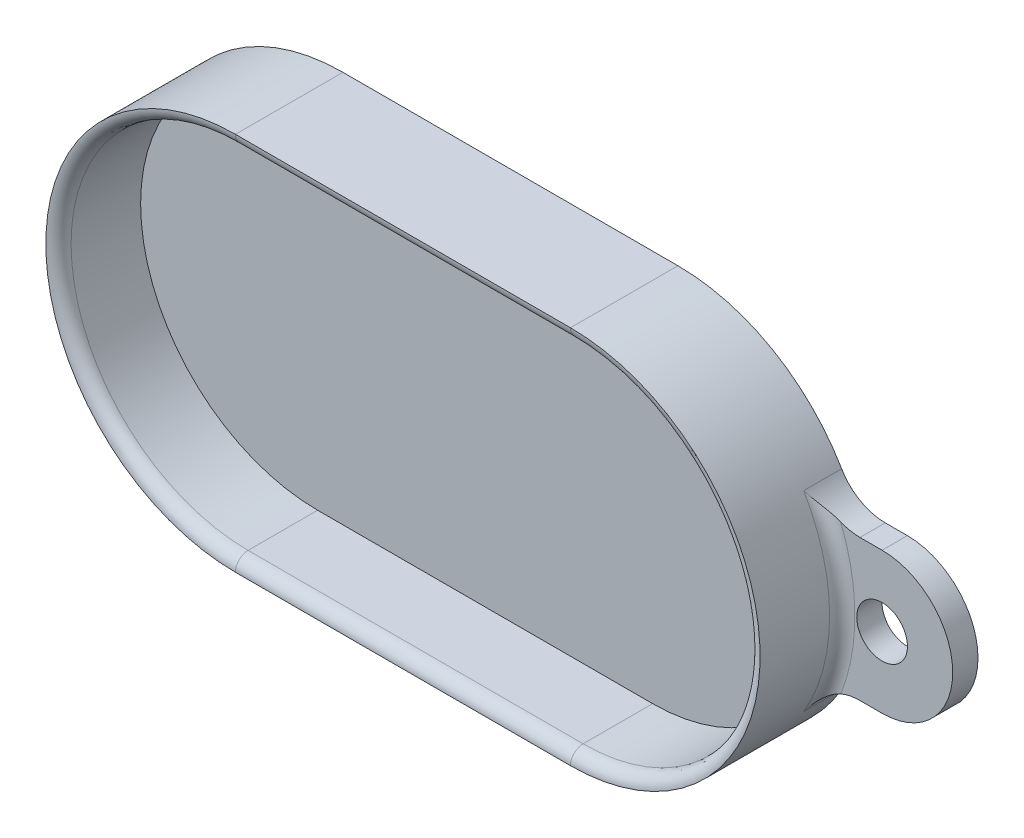
ISO-10303-21;
HEADER;
FILE_DESCRIPTION(('STEP AP214'),'2;1');
FILE_NAME('part.step','',(''),(''),'','','');
FILE_SCHEMA(('AUTOMOTIVE_DESIGN { 1 0 10303 214 1 1 1 1 }'));
ENDSEC;
DATA;
#1=APPLICATION_CONTEXT('core data for automotive mechanical design processes');
#2=APPLICATION_PROTOCOL_DEFINITION('international standard','automotive_design',2000,#1);
#3=PRODUCT_CONTEXT('',#1,'mechanical');
#4=PRODUCT('Part','Part','',(#3));
#5=PRODUCT_RELATED_PRODUCT_CATEGORY('part','',(#4));
#6=PRODUCT_DEFINITION_FORMATION('','',#4);
#7=PRODUCT_DEFINITION_CONTEXT('part definition',#1,'design');
#8=PRODUCT_DEFINITION('design','',#6,#7);
#9=PRODUCT_DEFINITION_SHAPE('','',#8);
#10=(LENGTH_UNIT() NAMED_UNIT(*) SI_UNIT(.MILLI.,.METRE.));
#11=(NAMED_UNIT(*) PLANE_ANGLE_UNIT() SI_UNIT($,.RADIAN.));
#12=(NAMED_UNIT(*) SI_UNIT($,.STERADIAN.) SOLID_ANGLE_UNIT());
#13=UNCERTAINTY_MEASURE_WITH_UNIT(LENGTH_MEASURE(1.E-05),#10,'distance_accuracy_value','');
#14=(GEOMETRIC_REPRESENTATION_CONTEXT(3) GLOBAL_UNCERTAINTY_ASSIGNED_CONTEXT((#13)) GLOBAL_UNIT_ASSIGNED_CONTEXT((#10,
#11,#12)) REPRESENTATION_CONTEXT('',''));
#15=CARTESIAN_POINT('',(0.,0.,0.));
#16=DIRECTION('',(0.,0.,1.));
#17=DIRECTION('',(1.,0.,0.));
#18=AXIS2_PLACEMENT_3D('',#15,#16,#17);
#19=CARTESIAN_POINT('',(-10.8682373472949,0.,6.5));
#20=DIRECTION('',(0.,0.,-1.));
#21=DIRECTION('',(-1.,0.,0.));
#22=AXIS2_PLACEMENT_3D('',#19,#20,#21);
#23=CYLINDRICAL_SURFACE('',#22,15.);
#24=DIRECTION('',(0.,0.,-1.));
#25=VECTOR('',#24,1.);
#26=CARTESIAN_POINT('',(-10.8682373472949,15.,6.5));
#27=LINE('',#26,#25);
#28=CARTESIAN_POINT('',(-10.8682373472949,15.,6.5));
#29=VERTEX_POINT('',#28);
#30=CARTESIAN_POINT('',(-10.8682373472949,15.,-2.));
#31=VERTEX_POINT('',#30);
#32=EDGE_CURVE('E140',#29,#31,#27,.T.);
#33=ORIENTED_EDGE('',*,*,#32,.T.);
#34=CARTESIAN_POINT('',(-10.8682373472949,0.,-2.));
#35=DIRECTION('',(0.,0.,-1.));
#36=DIRECTION('',(-1.,0.,0.));
#37=AXIS2_PLACEMENT_3D('',#34,#35,#36);
#38=CIRCLE('',#37,15.);
#39=CARTESIAN_POINT('',(-10.8682373472949,-15.,-2.));
#40=VERTEX_POINT('',#39);
#41=EDGE_CURVE('E144',#40,#31,#38,.T.);
#42=ORIENTED_EDGE('',*,*,#41,.F.);
#43=DIRECTION('',(0.,0.,-1.));
#44=VECTOR('',#43,1.);
#45=CARTESIAN_POINT('',(-10.8682373472949,-15.,6.5));
#46=LINE('',#45,#44);
#47=CARTESIAN_POINT('',(-10.8682373472949,-15.,6.5));
#48=VERTEX_POINT('',#47);
#49=EDGE_CURVE('E245',#48,#40,#46,.T.);
#50=ORIENTED_EDGE('',*,*,#49,.F.);
#51=CARTESIAN_POINT('',(-10.8682373472949,0.,6.5));
#52=DIRECTION('',(0.,0.,1.));
#53=DIRECTION('',(1.,0.,0.));
#54=AXIS2_PLACEMENT_3D('',#51,#52,#53);
#55=CIRCLE('',#54,15.);
#56=EDGE_CURVE('E146',#29,#48,#55,.T.);
#57=ORIENTED_EDGE('',*,*,#56,.F.);
#58=EDGE_LOOP('',(#33,#42,#50,#57));
#59=FACE_BOUND('',#58,.T.);
#60=ADVANCED_FACE('F33',(#59),#23,.T.);
#61=CARTESIAN_POINT('',(-10.8682373472949,-15.,6.5));
#62=DIRECTION('',(0.,1.,0.));
#63=DIRECTION('',(0.,0.,1.));
#64=AXIS2_PLACEMENT_3D('',#61,#62,#63);
#65=PLANE('',#64);
#66=ORIENTED_EDGE('',*,*,#49,.T.);
#67=DIRECTION('',(-1.,0.,0.));
#68=VECTOR('',#67,1.);
#69=CARTESIAN_POINT('',(-10.8682373472949,-15.,-2.));
#70=LINE('',#69,#68);
#71=CARTESIAN_POINT('',(15.6317626527051,-15.,-2.));
#72=VERTEX_POINT('',#71);
#73=EDGE_CURVE('E165',#72,#40,#70,.T.);
#74=ORIENTED_EDGE('',*,*,#73,.F.);
#75=DIRECTION('',(0.,0.,-1.));
#76=VECTOR('',#75,1.);
#77=CARTESIAN_POINT('',(15.6317626527051,-15.,6.5));
#78=LINE('',#77,#76);
#79=CARTESIAN_POINT('',(15.6317626527051,-15.,6.5));
#80=VERTEX_POINT('',#79);
#81=EDGE_CURVE('E243',#80,#72,#78,.T.);
#82=ORIENTED_EDGE('',*,*,#81,.F.);
#83=DIRECTION('',(1.,0.,0.));
#84=VECTOR('',#83,1.);
#85=CARTESIAN_POINT('',(-10.8682373472949,-15.,6.5));
#86=LINE('',#85,#84);
#87=EDGE_CURVE('E234',#48,#80,#86,.T.);
#88=ORIENTED_EDGE('',*,*,#87,.F.);
#89=EDGE_LOOP('',(#66,#74,#82,#88));
#90=FACE_BOUND('',#89,.T.);
#91=ADVANCED_FACE('F298',(#90),#65,.F.);
#92=CARTESIAN_POINT('',(15.6317626527051,0.,6.5));
#93=DIRECTION('',(0.,0.,-1.));
#94=DIRECTION('',(-1.,0.,0.));
#95=AXIS2_PLACEMENT_3D('',#92,#93,#94);
#96=CYLINDRICAL_SURFACE('',#95,15.);
#97=CARTESIAN_POINT('',(15.6317626527051,0.,1.));
#98=DIRECTION('',(0.,0.,-1.));
#99=DIRECTION('',(-1.,0.,0.));
#100=AXIS2_PLACEMENT_3D('',#97,#98,#99);
#101=CIRCLE('',#100,15.);
#102=CARTESIAN_POINT('',(28.5825038744634,-7.56824298018029,1.));
#103=VERTEX_POINT('',#102);
#104=CARTESIAN_POINT('',(28.5825038744634,7.56824298018029,1.));
#105=VERTEX_POINT('',#104);
#106=EDGE_CURVE('E247',#103,#105,#101,.F.);
#107=ORIENTED_EDGE('',*,*,#106,.T.);
#108=DIRECTION('',(0.,0.,1.));
#109=VECTOR('',#108,1.);
#110=CARTESIAN_POINT('',(28.5825038744634,7.56824298018029,-2.));
#111=LINE('',#110,#109);
#112=CARTESIAN_POINT('',(28.5825038744634,7.56824298018029,-2.));
#113=VERTEX_POINT('',#112);
#114=EDGE_CURVE('E211',#113,#105,#111,.T.);
#115=ORIENTED_EDGE('',*,*,#114,.F.);
#116=CARTESIAN_POINT('',(15.6317626527051,0.,-2.));
#117=DIRECTION('',(0.,0.,-1.));
#118=DIRECTION('',(-1.,0.,0.));
#119=AXIS2_PLACEMENT_3D('',#116,#117,#118);
#120=CIRCLE('',#119,15.);
#121=CARTESIAN_POINT('',(15.6317626527051,15.,-2.));
#122=VERTEX_POINT('',#121);
#123=EDGE_CURVE('E158',#122,#113,#120,.T.);
#124=ORIENTED_EDGE('',*,*,#123,.F.);
#125=DIRECTION('',(0.,0.,-1.));
#126=VECTOR('',#125,1.);
#127=CARTESIAN_POINT('',(15.6317626527051,15.,6.5));
#128=LINE('',#127,#126);
#129=CARTESIAN_POINT('',(15.6317626527051,15.,6.5));
#130=VERTEX_POINT('',#129);
#131=EDGE_CURVE('E150',#130,#122,#128,.T.);
#132=ORIENTED_EDGE('',*,*,#131,.F.);
#133=CARTESIAN_POINT('',(15.6317626527051,0.,6.5));
#134=DIRECTION('',(0.,0.,1.));
#135=DIRECTION('',(1.,0.,0.));
#136=AXIS2_PLACEMENT_3D('',#133,#134,#135);
#137=CIRCLE('',#136,15.);
#138=EDGE_CURVE('E237',#80,#130,#137,.T.);
#139=ORIENTED_EDGE('',*,*,#138,.F.);
#140=ORIENTED_EDGE('',*,*,#81,.T.);
#141=CARTESIAN_POINT('',(15.6317626527051,0.,-2.));
#142=DIRECTION('',(0.,0.,-1.));
#143=DIRECTION('',(-1.,0.,0.));
#144=AXIS2_PLACEMENT_3D('',#141,#142,#143);
#145=CIRCLE('',#144,15.);
#146=CARTESIAN_POINT('',(28.5825038744634,-7.56824298018029,-2.));
#147=VERTEX_POINT('',#146);
#148=EDGE_CURVE('E186',#147,#72,#145,.T.);
#149=ORIENTED_EDGE('',*,*,#148,.F.);
#150=DIRECTION('',(0.,0.,1.));
#151=VECTOR('',#150,1.);
#152=CARTESIAN_POINT('',(28.5825038744634,-7.56824298018029,-2.));
#153=LINE('',#152,#151);
#154=EDGE_CURVE('E189',#147,#103,#153,.T.);
#155=ORIENTED_EDGE('',*,*,#154,.T.);
#156=EDGE_LOOP('',(#107,#115,#124,#132,#139,#140,#149,#155));
#157=FACE_BOUND('',#156,.T.);
#158=ADVANCED_FACE('F295',(#157),#96,.T.);
#159=CARTESIAN_POINT('',(-10.8682373472949,15.,6.5));
#160=DIRECTION('',(0.,-1.,0.));
#161=DIRECTION('',(1.,0.,0.));
#162=AXIS2_PLACEMENT_3D('',#159,#160,#161);
#163=PLANE('',#162);
#164=ORIENTED_EDGE('',*,*,#131,.T.);
#165=DIRECTION('',(1.,0.,0.));
#166=VECTOR('',#165,1.);
#167=CARTESIAN_POINT('',(15.6317626527051,15.,-2.));
#168=LINE('',#167,#166);
#169=EDGE_CURVE('E154',#31,#122,#168,.T.);
#170=ORIENTED_EDGE('',*,*,#169,.F.);
#171=ORIENTED_EDGE('',*,*,#32,.F.);
#172=DIRECTION('',(-1.,0.,0.));
#173=VECTOR('',#172,1.);
#174=CARTESIAN_POINT('',(-10.8682373472949,15.,6.5));
#175=LINE('',#174,#173);
#176=EDGE_CURVE('E151',#130,#29,#175,.T.);
#177=ORIENTED_EDGE('',*,*,#176,.F.);
#178=EDGE_LOOP('',(#164,#170,#171,#177));
#179=FACE_BOUND('',#178,.T.);
#180=ADVANCED_FACE('F155',(#179),#163,.F.);
#181=CARTESIAN_POINT('',(-10.8682373472949,0.,6.5));
#182=DIRECTION('',(0.,0.,-1.));
#183=DIRECTION('',(-1.,0.,0.));
#184=AXIS2_PLACEMENT_3D('',#181,#182,#183);
#185=CYLINDRICAL_SURFACE('',#184,14.);
#186=DIRECTION('',(0.,0.,-1.));
#187=VECTOR('',#186,1.);
#188=CARTESIAN_POINT('',(-10.8682373472949,14.,6.5));
#189=LINE('',#188,#187);
#190=CARTESIAN_POINT('',(-10.8682373472949,14.,5.5));
#191=VERTEX_POINT('',#190);
#192=CARTESIAN_POINT('',(-10.8682373472949,14.,0.));
#193=VERTEX_POINT('',#192);
#194=EDGE_CURVE('E225',#191,#193,#189,.T.);
#195=ORIENTED_EDGE('',*,*,#194,.F.);
#196=CARTESIAN_POINT('',(-10.8682373472949,0.,5.5));
#197=DIRECTION('',(0.,0.,1.));
#198=DIRECTION('',(1.,0.,0.));
#199=AXIS2_PLACEMENT_3D('',#196,#197,#198);
#200=CIRCLE('',#199,14.);
#201=CARTESIAN_POINT('',(-10.8682373472949,-14.,5.5));
#202=VERTEX_POINT('',#201);
#203=EDGE_CURVE('E42',#191,#202,#200,.T.);
#204=ORIENTED_EDGE('',*,*,#203,.T.);
#205=DIRECTION('',(0.,0.,-1.));
#206=VECTOR('',#205,1.);
#207=CARTESIAN_POINT('',(-10.8682373472949,-14.,6.5));
#208=LINE('',#207,#206);
#209=CARTESIAN_POINT('',(-10.8682373472949,-14.,0.));
#210=VERTEX_POINT('',#209);
#211=EDGE_CURVE('E231',#202,#210,#208,.T.);
#212=ORIENTED_EDGE('',*,*,#211,.T.);
#213=CARTESIAN_POINT('',(-10.8682373472949,0.,0.));
#214=DIRECTION('',(0.,0.,1.));
#215=DIRECTION('',(1.,0.,0.));
#216=AXIS2_PLACEMENT_3D('',#213,#214,#215);
#217=CIRCLE('',#216,14.);
#218=EDGE_CURVE('E213',#193,#210,#217,.T.);
#219=ORIENTED_EDGE('',*,*,#218,.F.);
#220=EDGE_LOOP('',(#195,#204,#212,#219));
#221=FACE_BOUND('',#220,.T.);
#222=ADVANCED_FACE('F289',(#221),#185,.F.);
#223=CARTESIAN_POINT('',(-10.8682373472949,-14.,6.5));
#224=DIRECTION('',(0.,1.,0.));
#225=DIRECTION('',(-1.,0.,0.));
#226=AXIS2_PLACEMENT_3D('',#223,#224,#225);
#227=PLANE('',#226);
#228=ORIENTED_EDGE('',*,*,#211,.F.);
#229=DIRECTION('',(1.,0.,0.));
#230=VECTOR('',#229,1.);
#231=CARTESIAN_POINT('',(-10.8682373472949,-14.,5.5));
#232=LINE('',#231,#230);
#233=CARTESIAN_POINT('',(15.6317626527051,-14.,5.5));
#234=VERTEX_POINT('',#233);
#235=EDGE_CURVE('E513',#202,#234,#232,.T.);
#236=ORIENTED_EDGE('',*,*,#235,.T.);
#237=DIRECTION('',(0.,0.,-1.));
#238=VECTOR('',#237,1.);
#239=CARTESIAN_POINT('',(15.6317626527051,-14.,6.5));
#240=LINE('',#239,#238);
#241=CARTESIAN_POINT('',(15.6317626527051,-14.,0.));
#242=VERTEX_POINT('',#241);
#243=EDGE_CURVE('E229',#234,#242,#240,.T.);
#244=ORIENTED_EDGE('',*,*,#243,.T.);
#245=DIRECTION('',(1.,0.,0.));
#246=VECTOR('',#245,1.);
#247=CARTESIAN_POINT('',(-10.8682373472949,-14.,0.));
#248=LINE('',#247,#246);
#249=EDGE_CURVE('E216',#210,#242,#248,.T.);
#250=ORIENTED_EDGE('',*,*,#249,.F.);
#251=EDGE_LOOP('',(#228,#236,#244,#250));
#252=FACE_BOUND('',#251,.T.);
#253=ADVANCED_FACE('F285',(#252),#227,.T.);
#254=CARTESIAN_POINT('',(15.6317626527051,0.,6.5));
#255=DIRECTION('',(0.,0.,-1.));
#256=DIRECTION('',(-1.,0.,0.));
#257=AXIS2_PLACEMENT_3D('',#254,#255,#256);
#258=CYLINDRICAL_SURFACE('',#257,14.);
#259=ORIENTED_EDGE('',*,*,#243,.F.);
#260=CARTESIAN_POINT('',(15.6317626527051,0.,5.5));
#261=DIRECTION('',(0.,0.,1.));
#262=DIRECTION('',(1.,0.,0.));
#263=AXIS2_PLACEMENT_3D('',#260,#261,#262);
#264=CIRCLE('',#263,14.);
#265=CARTESIAN_POINT('',(15.6317626527051,14.,5.5));
#266=VERTEX_POINT('',#265);
#267=EDGE_CURVE('E493',#234,#266,#264,.T.);
#268=ORIENTED_EDGE('',*,*,#267,.T.);
#269=DIRECTION('',(0.,0.,-1.));
#270=VECTOR('',#269,1.);
#271=CARTESIAN_POINT('',(15.6317626527051,14.,6.5));
#272=LINE('',#271,#270);
#273=CARTESIAN_POINT('',(15.6317626527051,14.,0.));
#274=VERTEX_POINT('',#273);
#275=EDGE_CURVE('E227',#266,#274,#272,.T.);
#276=ORIENTED_EDGE('',*,*,#275,.T.);
#277=CARTESIAN_POINT('',(15.6317626527051,0.,0.));
#278=DIRECTION('',(0.,0.,1.));
#279=DIRECTION('',(1.,0.,0.));
#280=AXIS2_PLACEMENT_3D('',#277,#278,#279);
#281=CIRCLE('',#280,14.);
#282=EDGE_CURVE('E219',#242,#274,#281,.T.);
#283=ORIENTED_EDGE('',*,*,#282,.F.);
#284=EDGE_LOOP('',(#259,#268,#276,#283));
#285=FACE_BOUND('',#284,.T.);
#286=ADVANCED_FACE('F282',(#285),#258,.F.);
#287=CARTESIAN_POINT('',(-10.8682373472949,14.,6.5));
#288=DIRECTION('',(0.,-1.,0.));
#289=DIRECTION('',(1.,0.,0.));
#290=AXIS2_PLACEMENT_3D('',#287,#288,#289);
#291=PLANE('',#290);
#292=ORIENTED_EDGE('',*,*,#275,.F.);
#293=DIRECTION('',(-1.,0.,0.));
#294=VECTOR('',#293,1.);
#295=CARTESIAN_POINT('',(-10.8682373472949,14.,5.5));
#296=LINE('',#295,#294);
#297=EDGE_CURVE('E11',#266,#191,#296,.T.);
#298=ORIENTED_EDGE('',*,*,#297,.T.);
#299=ORIENTED_EDGE('',*,*,#194,.T.);
#300=DIRECTION('',(-1.,0.,0.));
#301=VECTOR('',#300,1.);
#302=CARTESIAN_POINT('',(-10.8682373472949,14.,0.));
#303=LINE('',#302,#301);
#304=EDGE_CURVE('E222',#274,#193,#303,.T.);
#305=ORIENTED_EDGE('',*,*,#304,.F.);
#306=EDGE_LOOP('',(#292,#298,#299,#305));
#307=FACE_BOUND('',#306,.T.);
#308=ADVANCED_FACE('F278',(#307),#291,.T.);
#309=CARTESIAN_POINT('',(-10.8682373472949,0.,0.));
#310=DIRECTION('',(0.,0.,-1.));
#311=DIRECTION('',(-1.,0.,0.));
#312=AXIS2_PLACEMENT_3D('',#309,#310,#311);
#313=PLANE('',#312);
#314=ORIENTED_EDGE('',*,*,#304,.T.);
#315=ORIENTED_EDGE('',*,*,#218,.T.);
#316=ORIENTED_EDGE('',*,*,#249,.T.);
#317=ORIENTED_EDGE('',*,*,#282,.T.);
#318=EDGE_LOOP('',(#314,#315,#316,#317));
#319=FACE_BOUND('',#318,.T.);
#320=ADVANCED_FACE('F281',(#319),#313,.F.);
#321=CARTESIAN_POINT('',(-10.8682373472949,0.,-2.));
#322=DIRECTION('',(0.,0.,-1.));
#323=DIRECTION('',(-1.,0.,0.));
#324=AXIS2_PLACEMENT_3D('',#321,#322,#323);
#325=PLANE('',#324);
#326=ORIENTED_EDGE('',*,*,#41,.T.);
#327=ORIENTED_EDGE('',*,*,#169,.T.);
#328=ORIENTED_EDGE('',*,*,#123,.T.);
#329=CARTESIAN_POINT('',(32.0360348669323,9.58644110822837,-2.));
#330=DIRECTION('',(0.,0.,1.));
#331=DIRECTION('',(1.,0.,0.));
#332=AXIS2_PLACEMENT_3D('',#329,#330,#331);
#333=CIRCLE('',#332,4.);
#334=CARTESIAN_POINT('',(32.0360348669323,5.58644110822837,-2.));
#335=VERTEX_POINT('',#334);
#336=EDGE_CURVE('E176',#113,#335,#333,.T.);
#337=ORIENTED_EDGE('',*,*,#336,.T.);
#338=DIRECTION('',(1.,0.,0.));
#339=VECTOR('',#338,1.);
#340=CARTESIAN_POINT('',(33.7817353802379,5.58644110822837,-2.));
#341=LINE('',#340,#339);
#342=CARTESIAN_POINT('',(33.7817353802379,5.58644110822837,-2.));
#343=VERTEX_POINT('',#342);
#344=EDGE_CURVE('E178',#335,#343,#341,.T.);
#345=ORIENTED_EDGE('',*,*,#344,.T.);
#346=CARTESIAN_POINT('',(33.7817353802379,0.,-2.));
#347=DIRECTION('',(0.,0.,-1.));
#348=DIRECTION('',(-1.,0.,0.));
#349=AXIS2_PLACEMENT_3D('',#346,#347,#348);
#350=CIRCLE('',#349,5.58644110822837);
#351=CARTESIAN_POINT('',(33.7817353802379,-5.58644110822836,-2.));
#352=VERTEX_POINT('',#351);
#353=EDGE_CURVE('E180',#343,#352,#350,.T.);
#354=ORIENTED_EDGE('',*,*,#353,.T.);
#355=DIRECTION('',(-1.,0.,0.));
#356=VECTOR('',#355,1.);
#357=CARTESIAN_POINT('',(33.7817353802379,-5.58644110822836,-2.));
#358=LINE('',#357,#356);
#359=CARTESIAN_POINT('',(32.0360348669323,-5.58644110822836,-2.));
#360=VERTEX_POINT('',#359);
#361=EDGE_CURVE('E182',#352,#360,#358,.T.);
#362=ORIENTED_EDGE('',*,*,#361,.T.);
#363=CARTESIAN_POINT('',(32.0360348669323,-9.58644110822837,-2.));
#364=DIRECTION('',(0.,0.,1.));
#365=DIRECTION('',(-1.,0.,0.));
#366=AXIS2_PLACEMENT_3D('',#363,#364,#365);
#367=CIRCLE('',#366,4.);
#368=EDGE_CURVE('E184',#360,#147,#367,.T.);
#369=ORIENTED_EDGE('',*,*,#368,.T.);
#370=ORIENTED_EDGE('',*,*,#148,.T.);
#371=ORIENTED_EDGE('',*,*,#73,.T.);
#372=EDGE_LOOP('',(#326,#327,#328,#337,#345,#354,#362,#369,#370,#371));
#373=FACE_BOUND('',#372,.T.);
#374=CARTESIAN_POINT('',(33.7817353802379,0.,-2.));
#375=DIRECTION('',(0.,0.,-1.));
#376=DIRECTION('',(-1.,0.,0.));
#377=AXIS2_PLACEMENT_3D('',#374,#375,#376);
#378=CIRCLE('',#377,2.00590693022116);
#379=CARTESIAN_POINT('',(31.7758284500167,0.,-2.));
#380=VERTEX_POINT('',#379);
#381=EDGE_CURVE('E193',#380,#380,#378,.T.);
#382=ORIENTED_EDGE('',*,*,#381,.F.);
#383=EDGE_LOOP('',(#382));
#384=FACE_BOUND('',#383,.T.);
#385=ADVANCED_FACE('F161',(#373,#384),#325,.T.);
#386=CARTESIAN_POINT('',(32.0360348669323,9.58644110822837,0.));
#387=DIRECTION('',(0.,0.,1.));
#388=DIRECTION('',(1.,0.,0.));
#389=AXIS2_PLACEMENT_3D('',#386,#387,#388);
#390=CIRCLE('',#389,4.);
#391=CARTESIAN_POINT('',(30.5083112412719,5.88967758812071,0.));
#392=VERTEX_POINT('',#391);
#393=CARTESIAN_POINT('',(32.0360348669323,5.58644110822837,0.));
#394=VERTEX_POINT('',#393);
#395=EDGE_CURVE('E190',#392,#394,#390,.T.);
#396=ORIENTED_EDGE('',*,*,#395,.F.);
#397=CARTESIAN_POINT('',(15.6317626527051,0.,0.));
#398=DIRECTION('',(0.,0.,-1.));
#399=DIRECTION('',(-1.,0.,0.));
#400=AXIS2_PLACEMENT_3D('',#397,#398,#399);
#401=CIRCLE('',#400,16.);
#402=CARTESIAN_POINT('',(30.5083112412719,-5.88967758812071,0.));
#403=VERTEX_POINT('',#402);
#404=EDGE_CURVE('E250',#392,#403,#401,.T.);
#405=ORIENTED_EDGE('',*,*,#404,.T.);
#406=CARTESIAN_POINT('',(32.0360348669323,-9.58644110822837,0.));
#407=DIRECTION('',(0.,0.,1.));
#408=DIRECTION('',(-1.,0.,0.));
#409=AXIS2_PLACEMENT_3D('',#406,#407,#408);
#410=CIRCLE('',#409,4.);
#411=CARTESIAN_POINT('',(32.0360348669323,-5.58644110822836,0.));
#412=VERTEX_POINT('',#411);
#413=EDGE_CURVE('E166',#412,#403,#410,.T.);
#414=ORIENTED_EDGE('',*,*,#413,.F.);
#415=DIRECTION('',(-1.,0.,0.));
#416=VECTOR('',#415,1.);
#417=CARTESIAN_POINT('',(33.7817353802379,-5.58644110822836,0.));
#418=LINE('',#417,#416);
#419=CARTESIAN_POINT('',(33.7817353802379,-5.58644110822836,0.));
#420=VERTEX_POINT('',#419);
#421=EDGE_CURVE('E169',#420,#412,#418,.T.);
#422=ORIENTED_EDGE('',*,*,#421,.F.);
#423=CARTESIAN_POINT('',(33.7817353802379,0.,0.));
#424=DIRECTION('',(0.,0.,-1.));
#425=DIRECTION('',(-1.,0.,0.));
#426=AXIS2_PLACEMENT_3D('',#423,#424,#425);
#427=CIRCLE('',#426,5.58644110822837);
#428=CARTESIAN_POINT('',(33.7817353802379,5.58644110822837,0.));
#429=VERTEX_POINT('',#428);
#430=EDGE_CURVE('E195',#429,#420,#427,.T.);
#431=ORIENTED_EDGE('',*,*,#430,.F.);
#432=DIRECTION('',(1.,0.,0.));
#433=VECTOR('',#432,1.);
#434=CARTESIAN_POINT('',(33.7817353802379,5.58644110822837,0.));
#435=LINE('',#434,#433);
#436=EDGE_CURVE('E192',#394,#429,#435,.T.);
#437=ORIENTED_EDGE('',*,*,#436,.F.);
#438=EDGE_LOOP('',(#396,#405,#414,#422,#431,#437));
#439=FACE_BOUND('',#438,.T.);
#440=CARTESIAN_POINT('',(33.7817353802379,0.,0.));
#441=DIRECTION('',(0.,0.,-1.));
#442=DIRECTION('',(-1.,0.,0.));
#443=AXIS2_PLACEMENT_3D('',#440,#441,#442);
#444=CIRCLE('',#443,2.00590693022116);
#445=CARTESIAN_POINT('',(31.7758284500167,0.,0.));
#446=VERTEX_POINT('',#445);
#447=EDGE_CURVE('E172',#446,#446,#444,.T.);
#448=ORIENTED_EDGE('',*,*,#447,.T.);
#449=EDGE_LOOP('',(#448));
#450=FACE_BOUND('',#449,.T.);
#451=ADVANCED_FACE('F275',(#439,#450),#313,.F.);
#452=CARTESIAN_POINT('',(32.0360348669323,9.58644110822837,-2.));
#453=DIRECTION('',(0.,0.,1.));
#454=DIRECTION('',(1.,0.,0.));
#455=AXIS2_PLACEMENT_3D('',#452,#453,#454);
#456=CYLINDRICAL_SURFACE('',#455,4.);
#457=ORIENTED_EDGE('',*,*,#114,.T.);
#458=CARTESIAN_POINT('',(30.5083112412719,5.88967758812071,0.));
#459=CARTESIAN_POINT('',(30.4544771415101,5.9119155026662,1.44328893789679E-05));
#460=CARTESIAN_POINT('',(30.4011925644505,5.93532154021092,0.00262722436849299));
#461=CARTESIAN_POINT('',(30.2961303592471,5.98421082512884,0.0123510055301959));
#462=CARTESIAN_POINT('',(30.2443498297205,6.00968965493959,0.0194526365685107));
#463=CARTESIAN_POINT('',(30.1429688102883,6.06230462082091,0.0373745027260854));
#464=CARTESIAN_POINT('',(30.093352108128,6.08942239704868,0.0481582024273429));
#465=CARTESIAN_POINT('',(29.9958799896177,6.14537619600545,0.0729083539610701));
#466=CARTESIAN_POINT('',(29.9480258144741,6.17421339352338,0.0868770007344808));
#467=CARTESIAN_POINT('',(29.8257078423188,6.2514146097959,0.12679950138535));
#468=CARTESIAN_POINT('',(29.7527125640093,6.30101191025245,0.154883420199885));
#469=CARTESIAN_POINT('',(29.6116028662887,6.40371373541573,0.2163587412192));
#470=CARTESIAN_POINT('',(29.5434905205367,6.45681973199577,0.249752379182677));
#471=CARTESIAN_POINT('',(29.4116821757599,6.56647998216729,0.320782996379813));
#472=CARTESIAN_POINT('',(29.348014292488,6.62305256306,0.358443618759537));
#473=CARTESIAN_POINT('',(29.2254095067512,6.73907299984469,0.436813545936741));
#474=CARTESIAN_POINT('',(29.1664717098446,6.79852030871303,0.477522271521683));
#475=CARTESIAN_POINT('',(29.0085556031515,6.96795951737032,0.594060809449658));
#476=CARTESIAN_POINT('',(28.9145469562206,7.08092870919907,0.672329656996974));
#477=CARTESIAN_POINT('',(28.7406090709155,7.31458826224969,0.831905451347539));
#478=CARTESIAN_POINT('',(28.6606422783613,7.43525681454135,0.913203567275106));
#479=CARTESIAN_POINT('',(28.5858019215043,7.56260732069562,0.996325500670258));
#480=CARTESIAN_POINT('',(28.5841511664912,7.56542416336159,0.998162763195345));
#481=CARTESIAN_POINT('',(28.5825038744634,7.56824298018029,1.));
#482=B_SPLINE_CURVE_WITH_KNOTS('',3,(#458,#459,#460,#461,#462,#463,#464,#465,#466,#467,#468,
#469,#470,#471,#472,#473,#474,#475,#476,#477,#478,#479,#480,#481),.UNSPECIFIED.,.F.,.F.,(4,2,2,
2,2,2,2,2,2,2,2,4),(0.,0.174578460852934,0.348794143554208,0.521329116328604,0.693983354788977,
0.971376915767644,1.24888758943321,1.52801899335449,1.80709748958851,2.30569056852329,
2.80292917558109,2.81416821171784),.UNSPECIFIED.);
#483=EDGE_CURVE('E252',#105,#392,#482,.F.);
#484=ORIENTED_EDGE('',*,*,#483,.T.);
#485=ORIENTED_EDGE('',*,*,#395,.T.);
#486=DIRECTION('',(0.,0.,1.));
#487=VECTOR('',#486,1.);
#488=CARTESIAN_POINT('',(32.0360348669323,5.58644110822837,-2.));
#489=LINE('',#488,#487);
#490=EDGE_CURVE('E208',#335,#394,#489,.T.);
#491=ORIENTED_EDGE('',*,*,#490,.F.);
#492=ORIENTED_EDGE('',*,*,#336,.F.);
#493=EDGE_LOOP('',(#457,#484,#485,#491,#492));
#494=FACE_BOUND('',#493,.T.);
#495=ADVANCED_FACE('F269',(#494),#456,.F.);
#496=CARTESIAN_POINT('',(33.7817353802379,5.58644110822837,-2.));
#497=DIRECTION('',(0.,-1.,0.));
#498=DIRECTION('',(0.,0.,-1.));
#499=AXIS2_PLACEMENT_3D('',#496,#497,#498);
#500=PLANE('',#499);
#501=ORIENTED_EDGE('',*,*,#436,.T.);
#502=DIRECTION('',(0.,0.,1.));
#503=VECTOR('',#502,1.);
#504=CARTESIAN_POINT('',(33.7817353802379,5.58644110822837,-2.));
#505=LINE('',#504,#503);
#506=EDGE_CURVE('E205',#343,#429,#505,.T.);
#507=ORIENTED_EDGE('',*,*,#506,.F.);
#508=ORIENTED_EDGE('',*,*,#344,.F.);
#509=ORIENTED_EDGE('',*,*,#490,.T.);
#510=EDGE_LOOP('',(#501,#507,#508,#509));
#511=FACE_BOUND('',#510,.T.);
#512=ADVANCED_FACE('F274',(#511),#500,.F.);
#513=CARTESIAN_POINT('',(33.7817353802379,0.,-2.));
#514=DIRECTION('',(0.,0.,1.));
#515=DIRECTION('',(1.,0.,0.));
#516=AXIS2_PLACEMENT_3D('',#513,#514,#515);
#517=CYLINDRICAL_SURFACE('',#516,5.58644110822837);
#518=ORIENTED_EDGE('',*,*,#430,.T.);
#519=DIRECTION('',(0.,0.,1.));
#520=VECTOR('',#519,1.);
#521=CARTESIAN_POINT('',(33.7817353802379,-5.58644110822836,-2.));
#522=LINE('',#521,#520);
#523=EDGE_CURVE('E202',#352,#420,#522,.T.);
#524=ORIENTED_EDGE('',*,*,#523,.F.);
#525=ORIENTED_EDGE('',*,*,#353,.F.);
#526=ORIENTED_EDGE('',*,*,#506,.T.);
#527=EDGE_LOOP('',(#518,#524,#525,#526));
#528=FACE_BOUND('',#527,.T.);
#529=ADVANCED_FACE('F366',(#528),#517,.T.);
#530=CARTESIAN_POINT('',(33.7817353802379,-5.58644110822836,-2.));
#531=DIRECTION('',(0.,1.,0.));
#532=DIRECTION('',(0.,0.,1.));
#533=AXIS2_PLACEMENT_3D('',#530,#531,#532);
#534=PLANE('',#533);
#535=ORIENTED_EDGE('',*,*,#421,.T.);
#536=DIRECTION('',(0.,0.,1.));
#537=VECTOR('',#536,1.);
#538=CARTESIAN_POINT('',(32.0360348669323,-5.58644110822836,-2.));
#539=LINE('',#538,#537);
#540=EDGE_CURVE('E199',#360,#412,#539,.T.);
#541=ORIENTED_EDGE('',*,*,#540,.F.);
#542=ORIENTED_EDGE('',*,*,#361,.F.);
#543=ORIENTED_EDGE('',*,*,#523,.T.);
#544=EDGE_LOOP('',(#535,#541,#542,#543));
#545=FACE_BOUND('',#544,.T.);
#546=ADVANCED_FACE('F373',(#545),#534,.F.);
#547=CARTESIAN_POINT('',(32.0360348669323,-9.58644110822837,-2.));
#548=DIRECTION('',(0.,0.,1.));
#549=DIRECTION('',(1.,0.,0.));
#550=AXIS2_PLACEMENT_3D('',#547,#548,#549);
#551=CYLINDRICAL_SURFACE('',#550,4.);
#552=ORIENTED_EDGE('',*,*,#413,.T.);
#553=CARTESIAN_POINT('',(30.5083112412719,-5.88967758812071,0.));
#554=CARTESIAN_POINT('',(30.4544771415101,-5.9119155026662,1.44328893787197E-05));
#555=CARTESIAN_POINT('',(30.4011925644505,-5.93532154021092,0.00262722436849305));
#556=CARTESIAN_POINT('',(30.296130359247,-5.98421082512884,0.012351005530197));
#557=CARTESIAN_POINT('',(30.2443498297205,-6.00968965493959,0.0194526365685125));
#558=CARTESIAN_POINT('',(30.1429688102883,-6.06230462082091,0.0373745027260876));
#559=CARTESIAN_POINT('',(30.093352108128,-6.08942239704868,0.0481582024273444));
#560=CARTESIAN_POINT('',(29.9958799896177,-6.14537619600545,0.0729083539610707));
#561=CARTESIAN_POINT('',(29.9480258144741,-6.17421339352338,0.0868770007344812));
#562=CARTESIAN_POINT('',(29.8257078423188,-6.2514146097959,0.12679950138535));
#563=CARTESIAN_POINT('',(29.7527125640093,-6.30101191025245,0.154883420199885));
#564=CARTESIAN_POINT('',(29.6116028662887,-6.40371373541572,0.2163587412192));
#565=CARTESIAN_POINT('',(29.5434905205367,-6.45681973199576,0.249752379182677));
#566=CARTESIAN_POINT('',(29.4116821757599,-6.56647998216728,0.320782996379814));
#567=CARTESIAN_POINT('',(29.348014292488,-6.62305256305999,0.358443618759539));
#568=CARTESIAN_POINT('',(29.2254095067512,-6.73907299984469,0.436813545936742));
#569=CARTESIAN_POINT('',(29.1664717098446,-6.79852030871303,0.47752227152168));
#570=CARTESIAN_POINT('',(29.0085556031515,-6.96795951737033,0.594060809449663));
#571=CARTESIAN_POINT('',(28.9145469562206,-7.08092870919907,0.672329656997007));
#572=CARTESIAN_POINT('',(28.7406090709155,-7.31458826224971,0.831905451347508));
#573=CARTESIAN_POINT('',(28.6606422783612,-7.4352568145414,0.913203567274983));
#574=CARTESIAN_POINT('',(28.5858019215043,-7.56260732069562,0.996325500670254));
#575=CARTESIAN_POINT('',(28.5841511664912,-7.56542416336159,0.998162763195343));
#576=CARTESIAN_POINT('',(28.5825038744634,-7.56824298018029,1.));
#577=B_SPLINE_CURVE_WITH_KNOTS('',3,(#553,#554,#555,#556,#557,#558,#559,#560,#561,#562,#563,
#564,#565,#566,#567,#568,#569,#570,#571,#572,#573,#574,#575,#576),.UNSPECIFIED.,.F.,.F.,(4,2,2,
2,2,2,2,2,2,2,2,4),(0.,0.17457846085294,0.348794143554222,0.521329116328612,0.693983354788981,
0.971376915767647,1.24888758943321,1.52801899335449,1.80709748958852,2.3056905685233,
2.8029291755811,2.81416821171784),.UNSPECIFIED.);
#578=EDGE_CURVE('E259',#403,#103,#577,.T.);
#579=ORIENTED_EDGE('',*,*,#578,.T.);
#580=ORIENTED_EDGE('',*,*,#154,.F.);
#581=ORIENTED_EDGE('',*,*,#368,.F.);
#582=ORIENTED_EDGE('',*,*,#540,.T.);
#583=EDGE_LOOP('',(#552,#579,#580,#581,#582));
#584=FACE_BOUND('',#583,.T.);
#585=ADVANCED_FACE('F380',(#584),#551,.F.);
#586=CARTESIAN_POINT('',(33.7817353802379,0.,-2.));
#587=DIRECTION('',(0.,0.,1.));
#588=DIRECTION('',(1.,0.,0.));
#589=AXIS2_PLACEMENT_3D('',#586,#587,#588);
#590=CYLINDRICAL_SURFACE('',#589,2.00590693022116);
#591=ORIENTED_EDGE('',*,*,#381,.T.);
#592=EDGE_LOOP('',(#591));
#593=FACE_BOUND('',#592,.T.);
#594=ORIENTED_EDGE('',*,*,#447,.F.);
#595=EDGE_LOOP('',(#594));
#596=FACE_BOUND('',#595,.T.);
#597=ADVANCED_FACE('F387',(#593,#596),#590,.F.);
#598=CARTESIAN_POINT('',(15.6317626527051,0.,1.));
#599=DIRECTION('',(0.,0.,-1.));
#600=DIRECTION('',(-1.,0.,0.));
#601=AXIS2_PLACEMENT_3D('',#598,#599,#600);
#602=TOROIDAL_SURFACE('',#601,16.,1.);
#603=ORIENTED_EDGE('',*,*,#578,.F.);
#604=ORIENTED_EDGE('',*,*,#404,.F.);
#605=ORIENTED_EDGE('',*,*,#483,.F.);
#606=ORIENTED_EDGE('',*,*,#106,.F.);
#607=EDGE_LOOP('',(#603,#604,#605,#606));
#608=FACE_BOUND('',#607,.T.);
#609=ADVANCED_FACE('F265',(#608),#602,.F.);
#610=CARTESIAN_POINT('',(-10.8682373472949,0.,5.5));
#611=DIRECTION('',(0.,0.,1.));
#612=DIRECTION('',(1.,0.,0.));
#613=AXIS2_PLACEMENT_3D('',#610,#611,#612);
#614=TOROIDAL_SURFACE('',#613,15.,1.);
#615=CARTESIAN_POINT('',(-10.8682373472949,15.,5.5));
#616=DIRECTION('',(1.,0.,0.));
#617=DIRECTION('',(0.,0.,-1.));
#618=AXIS2_PLACEMENT_3D('',#615,#616,#617);
#619=CIRCLE('',#618,1.);
#620=EDGE_CURVE('E495',#29,#191,#619,.T.);
#621=ORIENTED_EDGE('',*,*,#620,.F.);
#622=ORIENTED_EDGE('',*,*,#56,.T.);
#623=CARTESIAN_POINT('',(-10.8682373472949,-15.,5.5));
#624=DIRECTION('',(1.,0.,0.));
#625=DIRECTION('',(0.,0.,-1.));
#626=AXIS2_PLACEMENT_3D('',#623,#624,#625);
#627=CIRCLE('',#626,1.);
#628=EDGE_CURVE('E37',#202,#48,#627,.T.);
#629=ORIENTED_EDGE('',*,*,#628,.F.);
#630=ORIENTED_EDGE('',*,*,#203,.F.);
#631=EDGE_LOOP('',(#621,#622,#629,#630));
#632=FACE_BOUND('',#631,.T.);
#633=ADVANCED_FACE('F35',(#632),#614,.T.);
#634=CARTESIAN_POINT('',(-10.8682373472949,-15.,5.5));
#635=DIRECTION('',(1.,0.,0.));
#636=DIRECTION('',(0.,1.,0.));
#637=AXIS2_PLACEMENT_3D('',#634,#635,#636);
#638=CYLINDRICAL_SURFACE('',#637,1.);
#639=ORIENTED_EDGE('',*,*,#628,.T.);
#640=ORIENTED_EDGE('',*,*,#87,.T.);
#641=CARTESIAN_POINT('',(15.6317626527051,-15.,5.5));
#642=DIRECTION('',(1.,0.,0.));
#643=DIRECTION('',(0.,0.,-1.));
#644=AXIS2_PLACEMENT_3D('',#641,#642,#643);
#645=CIRCLE('',#644,1.);
#646=EDGE_CURVE('E489',#234,#80,#645,.T.);
#647=ORIENTED_EDGE('',*,*,#646,.F.);
#648=ORIENTED_EDGE('',*,*,#235,.F.);
#649=EDGE_LOOP('',(#639,#640,#647,#648));
#650=FACE_BOUND('',#649,.T.);
#651=ADVANCED_FACE('F404',(#650),#638,.T.);
#652=CARTESIAN_POINT('',(-10.8682373472949,15.,5.5));
#653=DIRECTION('',(-1.,0.,0.));
#654=DIRECTION('',(0.,-1.,0.));
#655=AXIS2_PLACEMENT_3D('',#652,#653,#654);
#656=CYLINDRICAL_SURFACE('',#655,1.);
#657=ORIENTED_EDGE('',*,*,#620,.T.);
#658=ORIENTED_EDGE('',*,*,#297,.F.);
#659=CARTESIAN_POINT('',(15.6317626527051,15.,5.5));
#660=DIRECTION('',(1.,0.,0.));
#661=DIRECTION('',(0.,0.,-1.));
#662=AXIS2_PLACEMENT_3D('',#659,#660,#661);
#663=CIRCLE('',#662,1.);
#664=EDGE_CURVE('E496',#130,#266,#663,.T.);
#665=ORIENTED_EDGE('',*,*,#664,.F.);
#666=ORIENTED_EDGE('',*,*,#176,.T.);
#667=EDGE_LOOP('',(#657,#658,#665,#666));
#668=FACE_BOUND('',#667,.T.);
#669=ADVANCED_FACE('F411',(#668),#656,.T.);
#670=CARTESIAN_POINT('',(15.6317626527051,0.,5.5));
#671=DIRECTION('',(0.,0.,1.));
#672=DIRECTION('',(1.,0.,0.));
#673=AXIS2_PLACEMENT_3D('',#670,#671,#672);
#674=TOROIDAL_SURFACE('',#673,15.,1.);
#675=ORIENTED_EDGE('',*,*,#646,.T.);
#676=ORIENTED_EDGE('',*,*,#138,.T.);
#677=ORIENTED_EDGE('',*,*,#664,.T.);
#678=ORIENTED_EDGE('',*,*,#267,.F.);
#679=EDGE_LOOP('',(#675,#676,#677,#678));
#680=FACE_BOUND('',#679,.T.);
#681=ADVANCED_FACE('F418',(#680),#674,.T.);
#682=CLOSED_SHELL('',(#60,#91,#158,#180,#222,#253,#286,#308,#320,#385,#451,#495,#512,#529,#546,
#585,#597,#609,#633,#651,#669,#681));
#683=MANIFOLD_SOLID_BREP('B2',#682);
#684=ADVANCED_BREP_SHAPE_REPRESENTATION('',(#18,#683),#14);
#685=SHAPE_DEFINITION_REPRESENTATION(#9,#684);
ENDSEC;
END-ISO-10303-21;
